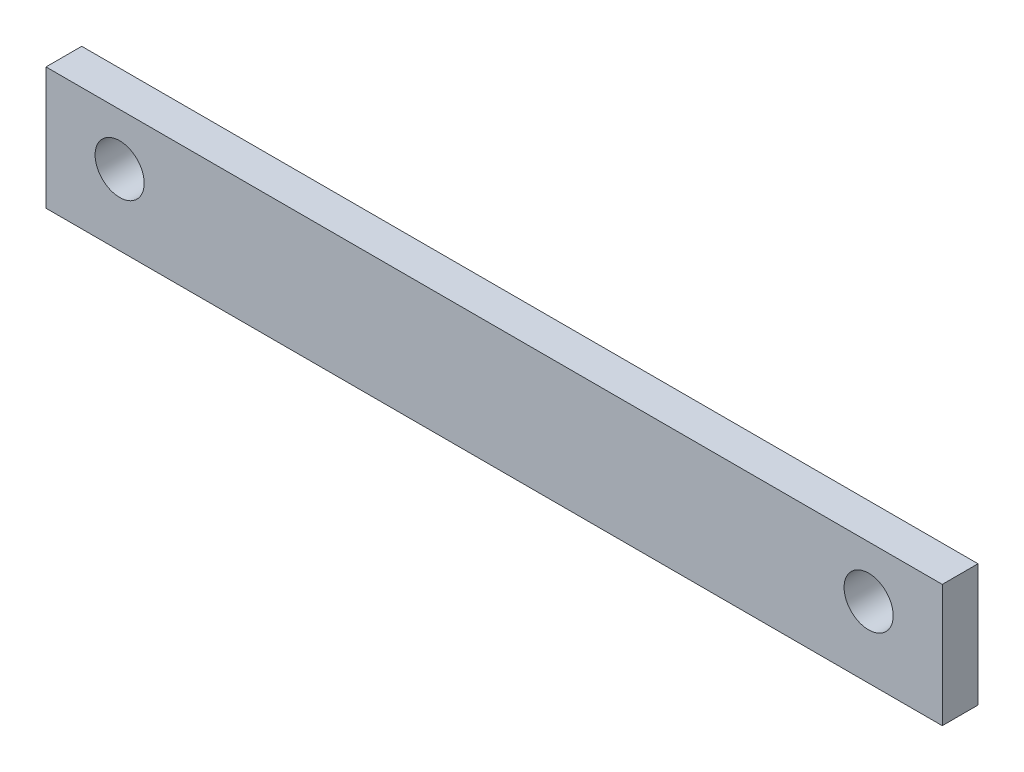
ISO-10303-21;
HEADER;
FILE_DESCRIPTION(('STEP AP214'),'2;1');
FILE_NAME('part.step','',(''),(''),'','','');
FILE_SCHEMA(('AUTOMOTIVE_DESIGN { 1 0 10303 214 1 1 1 1 }'));
ENDSEC;
DATA;
#1=APPLICATION_CONTEXT('core data for automotive mechanical design processes');
#2=APPLICATION_PROTOCOL_DEFINITION('international standard','automotive_design',2000,#1);
#3=PRODUCT_CONTEXT('',#1,'mechanical');
#4=PRODUCT('Part','Part','',(#3));
#5=PRODUCT_RELATED_PRODUCT_CATEGORY('part','',(#4));
#6=PRODUCT_DEFINITION_FORMATION('','',#4);
#7=PRODUCT_DEFINITION_CONTEXT('part definition',#1,'design');
#8=PRODUCT_DEFINITION('design','',#6,#7);
#9=PRODUCT_DEFINITION_SHAPE('','',#8);
#10=(LENGTH_UNIT() NAMED_UNIT(*) SI_UNIT(.MILLI.,.METRE.));
#11=(NAMED_UNIT(*) PLANE_ANGLE_UNIT() SI_UNIT($,.RADIAN.));
#12=(NAMED_UNIT(*) SI_UNIT($,.STERADIAN.) SOLID_ANGLE_UNIT());
#13=UNCERTAINTY_MEASURE_WITH_UNIT(LENGTH_MEASURE(1.E-05),#10,'distance_accuracy_value','');
#14=(GEOMETRIC_REPRESENTATION_CONTEXT(3) GLOBAL_UNCERTAINTY_ASSIGNED_CONTEXT((#13)) GLOBAL_UNIT_ASSIGNED_CONTEXT((#10,
#11,#12)) REPRESENTATION_CONTEXT('',''));
#15=CARTESIAN_POINT('',(0.,0.,0.));
#16=DIRECTION('',(0.,0.,1.));
#17=DIRECTION('',(1.,0.,0.));
#18=AXIS2_PLACEMENT_3D('',#15,#16,#17);
#19=CARTESIAN_POINT('',(0.,16.5927116999957,4.));
#20=DIRECTION('',(0.,-1.,0.));
#21=DIRECTION('',(0.,0.,-1.));
#22=AXIS2_PLACEMENT_3D('',#19,#20,#21);
#23=PLANE('',#22);
#24=DIRECTION('',(-1.,0.,0.));
#25=VECTOR('',#24,1.);
#26=CARTESIAN_POINT('',(0.,16.5927116999957,0.));
#27=LINE('',#26,#25);
#28=CARTESIAN_POINT('',(75.2676570005723,16.5927116999957,0.));
#29=VERTEX_POINT('',#28);
#30=CARTESIAN_POINT('',(-25.0721783393802,16.5927116999957,0.));
#31=VERTEX_POINT('',#30);
#32=EDGE_CURVE('E65',#29,#31,#27,.T.);
#33=ORIENTED_EDGE('',*,*,#32,.T.);
#34=DIRECTION('',(0.,0.,1.));
#35=VECTOR('',#34,1.);
#36=CARTESIAN_POINT('',(-25.0721783393802,16.5927116999957,0.));
#37=LINE('',#36,#35);
#38=CARTESIAN_POINT('',(-25.0721783393802,16.5927116999957,4.));
#39=VERTEX_POINT('',#38);
#40=EDGE_CURVE('E98',#31,#39,#37,.T.);
#41=ORIENTED_EDGE('',*,*,#40,.T.);
#42=DIRECTION('',(-1.,0.,0.));
#43=VECTOR('',#42,1.);
#44=CARTESIAN_POINT('',(0.,16.5927116999957,4.));
#45=LINE('',#44,#43);
#46=CARTESIAN_POINT('',(75.2676570005723,16.5927116999957,4.));
#47=VERTEX_POINT('',#46);
#48=EDGE_CURVE('E56',#47,#39,#45,.T.);
#49=ORIENTED_EDGE('',*,*,#48,.F.);
#50=DIRECTION('',(0.,0.,1.));
#51=VECTOR('',#50,1.);
#52=CARTESIAN_POINT('',(75.2676570005723,16.5927116999957,0.));
#53=LINE('',#52,#51);
#54=EDGE_CURVE('E129',#29,#47,#53,.T.);
#55=ORIENTED_EDGE('',*,*,#54,.F.);
#56=EDGE_LOOP('',(#33,#41,#49,#55));
#57=FACE_BOUND('',#56,.T.);
#58=ADVANCED_FACE('F45',(#57),#23,.F.);
#59=CARTESIAN_POINT('',(-25.0721783393802,0.,4.));
#60=DIRECTION('',(1.,0.,0.));
#61=DIRECTION('',(0.,0.,-1.));
#62=AXIS2_PLACEMENT_3D('',#59,#60,#61);
#63=PLANE('',#62);
#64=DIRECTION('',(0.,-1.,0.));
#65=VECTOR('',#64,1.);
#66=CARTESIAN_POINT('',(-25.0721783393802,0.,0.));
#67=LINE('',#66,#65);
#68=CARTESIAN_POINT('',(-25.0721783393802,2.88749169818929,0.));
#69=VERTEX_POINT('',#68);
#70=EDGE_CURVE('E49',#31,#69,#67,.T.);
#71=ORIENTED_EDGE('',*,*,#70,.T.);
#72=DIRECTION('',(0.,0.,1.));
#73=VECTOR('',#72,1.);
#74=CARTESIAN_POINT('',(-25.0721783393802,2.88749169818929,0.));
#75=LINE('',#74,#73);
#76=CARTESIAN_POINT('',(-25.0721783393802,2.88749169818929,4.));
#77=VERTEX_POINT('',#76);
#78=EDGE_CURVE('E97',#69,#77,#75,.T.);
#79=ORIENTED_EDGE('',*,*,#78,.T.);
#80=DIRECTION('',(0.,-1.,0.));
#81=VECTOR('',#80,1.);
#82=CARTESIAN_POINT('',(-25.0721783393802,0.,4.));
#83=LINE('',#82,#81);
#84=EDGE_CURVE('E11',#39,#77,#83,.T.);
#85=ORIENTED_EDGE('',*,*,#84,.F.);
#86=ORIENTED_EDGE('',*,*,#40,.F.);
#87=EDGE_LOOP('',(#71,#79,#85,#86));
#88=FACE_BOUND('',#87,.T.);
#89=ADVANCED_FACE('F95',(#88),#63,.F.);
#90=CARTESIAN_POINT('',(-16.8270949567841,10.8096658281083,4.));
#91=DIRECTION('',(0.,0.,-1.));
#92=DIRECTION('',(-1.,0.,0.));
#93=AXIS2_PLACEMENT_3D('',#90,#91,#92);
#94=CYLINDRICAL_SURFACE('',#93,2.75);
#95=CARTESIAN_POINT('',(-16.8270949567841,10.8096658281083,4.));
#96=DIRECTION('',(0.,0.,1.));
#97=DIRECTION('',(1.,0.,0.));
#98=AXIS2_PLACEMENT_3D('',#95,#96,#97);
#99=CIRCLE('',#98,2.75);
#100=CARTESIAN_POINT('',(-14.0770949567841,10.8096658281083,4.));
#101=VERTEX_POINT('',#100);
#102=EDGE_CURVE('E101',#101,#101,#99,.T.);
#103=ORIENTED_EDGE('',*,*,#102,.T.);
#104=EDGE_LOOP('',(#103));
#105=FACE_BOUND('',#104,.T.);
#106=CARTESIAN_POINT('',(-16.8270949567841,10.8096658281083,0.));
#107=DIRECTION('',(0.,0.,1.));
#108=DIRECTION('',(1.,0.,0.));
#109=AXIS2_PLACEMENT_3D('',#106,#107,#108);
#110=CIRCLE('',#109,2.75);
#111=CARTESIAN_POINT('',(-14.0770949567841,10.8096658281083,0.));
#112=VERTEX_POINT('',#111);
#113=EDGE_CURVE('E133',#112,#112,#110,.T.);
#114=ORIENTED_EDGE('',*,*,#113,.F.);
#115=EDGE_LOOP('',(#114));
#116=FACE_BOUND('',#115,.T.);
#117=ADVANCED_FACE('F47',(#105,#116),#94,.F.);
#118=CARTESIAN_POINT('',(0.,0.,4.));
#119=DIRECTION('',(0.,0.,1.));
#120=DIRECTION('',(1.,0.,0.));
#121=AXIS2_PLACEMENT_3D('',#118,#119,#120);
#122=PLANE('',#121);
#123=ORIENTED_EDGE('',*,*,#84,.T.);
#124=DIRECTION('',(1.,0.,0.));
#125=VECTOR('',#124,1.);
#126=CARTESIAN_POINT('',(0.,2.88749169818929,4.));
#127=LINE('',#126,#125);
#128=CARTESIAN_POINT('',(75.2676570005723,2.88749169818929,4.));
#129=VERTEX_POINT('',#128);
#130=EDGE_CURVE('E105',#77,#129,#127,.T.);
#131=ORIENTED_EDGE('',*,*,#130,.T.);
#132=DIRECTION('',(0.,-1.,0.));
#133=VECTOR('',#132,1.);
#134=CARTESIAN_POINT('',(75.2676570005723,0.,4.));
#135=LINE('',#134,#133);
#136=EDGE_CURVE('E119',#47,#129,#135,.T.);
#137=ORIENTED_EDGE('',*,*,#136,.F.);
#138=ORIENTED_EDGE('',*,*,#48,.T.);
#139=EDGE_LOOP('',(#123,#131,#137,#138));
#140=FACE_BOUND('',#139,.T.);
#141=ORIENTED_EDGE('',*,*,#102,.F.);
#142=EDGE_LOOP('',(#141));
#143=FACE_BOUND('',#142,.T.);
#144=CARTESIAN_POINT('',(67.0225736179762,10.8096658281083,4.));
#145=DIRECTION('',(0.,0.,1.));
#146=DIRECTION('',(1.,0.,0.));
#147=AXIS2_PLACEMENT_3D('',#144,#145,#146);
#148=CIRCLE('',#147,2.75000000000001);
#149=CARTESIAN_POINT('',(69.7725736179762,10.8096658281083,4.));
#150=VERTEX_POINT('',#149);
#151=EDGE_CURVE('E112',#150,#150,#148,.F.);
#152=ORIENTED_EDGE('',*,*,#151,.T.);
#153=EDGE_LOOP('',(#152));
#154=FACE_BOUND('',#153,.T.);
#155=ADVANCED_FACE('F150',(#140,#143,#154),#122,.T.);
#156=CARTESIAN_POINT('',(0.,0.,0.));
#157=DIRECTION('',(0.,0.,1.));
#158=DIRECTION('',(1.,0.,0.));
#159=AXIS2_PLACEMENT_3D('',#156,#157,#158);
#160=PLANE('',#159);
#161=ORIENTED_EDGE('',*,*,#113,.T.);
#162=EDGE_LOOP('',(#161));
#163=FACE_BOUND('',#162,.T.);
#164=ORIENTED_EDGE('',*,*,#32,.F.);
#165=DIRECTION('',(0.,-1.,0.));
#166=VECTOR('',#165,1.);
#167=CARTESIAN_POINT('',(75.2676570005723,0.,0.));
#168=LINE('',#167,#166);
#169=CARTESIAN_POINT('',(75.2676570005723,2.88749169818929,0.));
#170=VERTEX_POINT('',#169);
#171=EDGE_CURVE('E110',#29,#170,#168,.T.);
#172=ORIENTED_EDGE('',*,*,#171,.T.);
#173=DIRECTION('',(1.,0.,0.));
#174=VECTOR('',#173,1.);
#175=CARTESIAN_POINT('',(0.,2.88749169818929,0.));
#176=LINE('',#175,#174);
#177=EDGE_CURVE('E103',#69,#170,#176,.T.);
#178=ORIENTED_EDGE('',*,*,#177,.F.);
#179=ORIENTED_EDGE('',*,*,#70,.F.);
#180=EDGE_LOOP('',(#164,#172,#178,#179));
#181=FACE_BOUND('',#180,.T.);
#182=CARTESIAN_POINT('',(67.0225736179762,10.8096658281083,0.));
#183=DIRECTION('',(0.,0.,1.));
#184=DIRECTION('',(1.,0.,0.));
#185=AXIS2_PLACEMENT_3D('',#182,#183,#184);
#186=CIRCLE('',#185,2.75000000000001);
#187=CARTESIAN_POINT('',(69.7725736179762,10.8096658281083,0.));
#188=VERTEX_POINT('',#187);
#189=EDGE_CURVE('E116',#188,#188,#186,.F.);
#190=ORIENTED_EDGE('',*,*,#189,.F.);
#191=EDGE_LOOP('',(#190));
#192=FACE_BOUND('',#191,.T.);
#193=ADVANCED_FACE('F108',(#163,#181,#192),#160,.F.);
#194=CARTESIAN_POINT('',(67.0225736179762,10.8096658281083,0.));
#195=DIRECTION('',(0.,0.,1.));
#196=DIRECTION('',(1.,0.,0.));
#197=AXIS2_PLACEMENT_3D('',#194,#195,#196);
#198=CYLINDRICAL_SURFACE('',#197,2.75000000000001);
#199=ORIENTED_EDGE('',*,*,#189,.T.);
#200=EDGE_LOOP('',(#199));
#201=FACE_BOUND('',#200,.T.);
#202=ORIENTED_EDGE('',*,*,#151,.F.);
#203=EDGE_LOOP('',(#202));
#204=FACE_BOUND('',#203,.T.);
#205=ADVANCED_FACE('F164',(#201,#204),#198,.F.);
#206=CARTESIAN_POINT('',(75.2676570005723,0.,0.));
#207=DIRECTION('',(-1.,0.,0.));
#208=DIRECTION('',(0.,0.,1.));
#209=AXIS2_PLACEMENT_3D('',#206,#207,#208);
#210=PLANE('',#209);
#211=ORIENTED_EDGE('',*,*,#136,.T.);
#212=DIRECTION('',(0.,0.,1.));
#213=VECTOR('',#212,1.);
#214=CARTESIAN_POINT('',(75.2676570005723,2.88749169818929,0.));
#215=LINE('',#214,#213);
#216=EDGE_CURVE('E81',#170,#129,#215,.T.);
#217=ORIENTED_EDGE('',*,*,#216,.F.);
#218=ORIENTED_EDGE('',*,*,#171,.F.);
#219=ORIENTED_EDGE('',*,*,#54,.T.);
#220=EDGE_LOOP('',(#211,#217,#218,#219));
#221=FACE_BOUND('',#220,.T.);
#222=ADVANCED_FACE('F168',(#221),#210,.F.);
#223=CARTESIAN_POINT('',(0.,2.88749169818929,0.));
#224=DIRECTION('',(0.,-1.,0.));
#225=DIRECTION('',(1.,0.,0.));
#226=AXIS2_PLACEMENT_3D('',#223,#224,#225);
#227=PLANE('',#226);
#228=ORIENTED_EDGE('',*,*,#130,.F.);
#229=ORIENTED_EDGE('',*,*,#78,.F.);
#230=ORIENTED_EDGE('',*,*,#177,.T.);
#231=ORIENTED_EDGE('',*,*,#216,.T.);
#232=EDGE_LOOP('',(#228,#229,#230,#231));
#233=FACE_BOUND('',#232,.T.);
#234=ADVANCED_FACE('F102',(#233),#227,.T.);
#235=CLOSED_SHELL('',(#58,#89,#117,#155,#193,#205,#222,#234));
#236=MANIFOLD_SOLID_BREP('B2',#235);
#237=ADVANCED_BREP_SHAPE_REPRESENTATION('',(#18,#236),#14);
#238=SHAPE_DEFINITION_REPRESENTATION(#9,#237);
ENDSEC;
END-ISO-10303-21;
